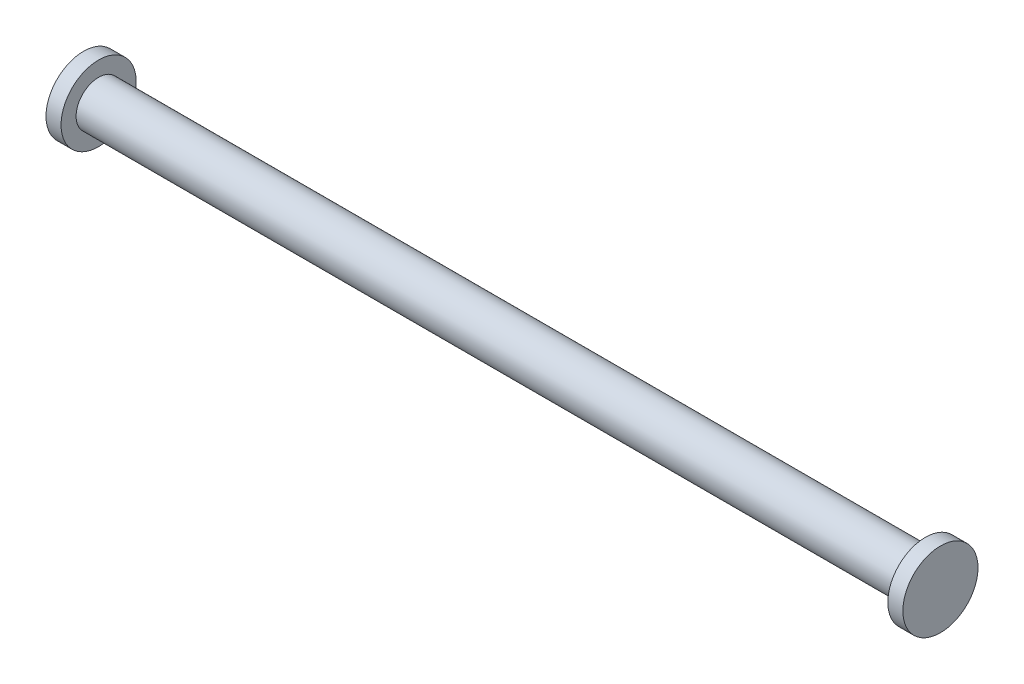
ISO-10303-21;
HEADER;
FILE_DESCRIPTION(('STEP AP214'),'2;1');
FILE_NAME('part.step','',(''),(''),'','','');
FILE_SCHEMA(('AUTOMOTIVE_DESIGN { 1 0 10303 214 1 1 1 1 }'));
ENDSEC;
DATA;
#1=APPLICATION_CONTEXT('core data for automotive mechanical design processes');
#2=APPLICATION_PROTOCOL_DEFINITION('international standard','automotive_design',2000,#1);
#3=PRODUCT_CONTEXT('',#1,'mechanical');
#4=PRODUCT('Part','Part','',(#3));
#5=PRODUCT_RELATED_PRODUCT_CATEGORY('part','',(#4));
#6=PRODUCT_DEFINITION_FORMATION('','',#4);
#7=PRODUCT_DEFINITION_CONTEXT('part definition',#1,'design');
#8=PRODUCT_DEFINITION('design','',#6,#7);
#9=PRODUCT_DEFINITION_SHAPE('','',#8);
#10=(LENGTH_UNIT() NAMED_UNIT(*) SI_UNIT(.MILLI.,.METRE.));
#11=(NAMED_UNIT(*) PLANE_ANGLE_UNIT() SI_UNIT($,.RADIAN.));
#12=(NAMED_UNIT(*) SI_UNIT($,.STERADIAN.) SOLID_ANGLE_UNIT());
#13=UNCERTAINTY_MEASURE_WITH_UNIT(LENGTH_MEASURE(1.E-05),#10,'distance_accuracy_value','');
#14=(GEOMETRIC_REPRESENTATION_CONTEXT(3) GLOBAL_UNCERTAINTY_ASSIGNED_CONTEXT((#13)) GLOBAL_UNIT_ASSIGNED_CONTEXT((#10,
#11,#12)) REPRESENTATION_CONTEXT('',''));
#15=CARTESIAN_POINT('',(0.,0.,0.));
#16=DIRECTION('',(0.,0.,1.));
#17=DIRECTION('',(1.,0.,0.));
#18=AXIS2_PLACEMENT_3D('',#15,#16,#17);
#19=CARTESIAN_POINT('',(139.7,0.,0.));
#20=DIRECTION('',(-1.,0.,0.));
#21=DIRECTION('',(0.,0.,1.));
#22=AXIS2_PLACEMENT_3D('',#19,#20,#21);
#23=CYLINDRICAL_SURFACE('',#22,3.81);
#24=CARTESIAN_POINT('',(139.7,0.,0.));
#25=DIRECTION('',(1.,0.,0.));
#26=DIRECTION('',(0.,0.,-1.));
#27=AXIS2_PLACEMENT_3D('',#24,#25,#26);
#28=CIRCLE('',#27,3.81);
#29=CARTESIAN_POINT('',(139.7,0.,-3.81));
#30=VERTEX_POINT('',#29);
#31=EDGE_CURVE('E10',#30,#30,#28,.T.);
#32=ORIENTED_EDGE('',*,*,#31,.F.);
#33=EDGE_LOOP('',(#32));
#34=FACE_BOUND('',#33,.T.);
#35=CARTESIAN_POINT('',(0.,0.,0.));
#36=DIRECTION('',(1.,0.,0.));
#37=DIRECTION('',(0.,0.,-1.));
#38=AXIS2_PLACEMENT_3D('',#35,#36,#37);
#39=CIRCLE('',#38,3.81);
#40=CARTESIAN_POINT('',(0.,0.,-3.81));
#41=VERTEX_POINT('',#40);
#42=EDGE_CURVE('E46',#41,#41,#39,.T.);
#43=ORIENTED_EDGE('',*,*,#42,.T.);
#44=EDGE_LOOP('',(#43));
#45=FACE_BOUND('',#44,.T.);
#46=ADVANCED_FACE('F43',(#34,#45),#23,.T.);
#47=CARTESIAN_POINT('',(142.24,0.,0.));
#48=DIRECTION('',(-1.,0.,0.));
#49=DIRECTION('',(0.,0.,1.));
#50=AXIS2_PLACEMENT_3D('',#47,#48,#49);
#51=CYLINDRICAL_SURFACE('',#50,6.35);
#52=CARTESIAN_POINT('',(142.24,0.,0.));
#53=DIRECTION('',(1.,0.,0.));
#54=DIRECTION('',(0.,0.,-1.));
#55=AXIS2_PLACEMENT_3D('',#52,#53,#54);
#56=CIRCLE('',#55,6.35);
#57=CARTESIAN_POINT('',(142.24,0.,-6.35));
#58=VERTEX_POINT('',#57);
#59=EDGE_CURVE('E51',#58,#58,#56,.T.);
#60=ORIENTED_EDGE('',*,*,#59,.F.);
#61=EDGE_LOOP('',(#60));
#62=FACE_BOUND('',#61,.T.);
#63=CARTESIAN_POINT('',(139.7,0.,0.));
#64=DIRECTION('',(1.,0.,0.));
#65=DIRECTION('',(0.,0.,-1.));
#66=AXIS2_PLACEMENT_3D('',#63,#64,#65);
#67=CIRCLE('',#66,6.35);
#68=CARTESIAN_POINT('',(139.7,0.,-6.35));
#69=VERTEX_POINT('',#68);
#70=EDGE_CURVE('E56',#69,#69,#67,.T.);
#71=ORIENTED_EDGE('',*,*,#70,.T.);
#72=EDGE_LOOP('',(#71));
#73=FACE_BOUND('',#72,.T.);
#74=ADVANCED_FACE('F97',(#62,#73),#51,.T.);
#75=CARTESIAN_POINT('',(142.24,0.,0.));
#76=DIRECTION('',(1.,0.,0.));
#77=DIRECTION('',(0.,0.,-1.));
#78=AXIS2_PLACEMENT_3D('',#75,#76,#77);
#79=PLANE('',#78);
#80=ORIENTED_EDGE('',*,*,#59,.T.);
#81=EDGE_LOOP('',(#80));
#82=FACE_BOUND('',#81,.T.);
#83=ADVANCED_FACE('F93',(#82),#79,.T.);
#84=CARTESIAN_POINT('',(139.7,0.,0.));
#85=DIRECTION('',(1.,0.,0.));
#86=DIRECTION('',(0.,0.,-1.));
#87=AXIS2_PLACEMENT_3D('',#84,#85,#86);
#88=PLANE('',#87);
#89=ORIENTED_EDGE('',*,*,#31,.T.);
#90=EDGE_LOOP('',(#89));
#91=FACE_BOUND('',#90,.T.);
#92=ORIENTED_EDGE('',*,*,#70,.F.);
#93=EDGE_LOOP('',(#92));
#94=FACE_BOUND('',#93,.T.);
#95=ADVANCED_FACE('F85',(#91,#94),#88,.F.);
#96=CARTESIAN_POINT('',(-2.54,0.,0.));
#97=DIRECTION('',(1.,0.,0.));
#98=DIRECTION('',(0.,0.,-1.));
#99=AXIS2_PLACEMENT_3D('',#96,#97,#98);
#100=CYLINDRICAL_SURFACE('',#99,6.35);
#101=CARTESIAN_POINT('',(-2.54,0.,0.));
#102=DIRECTION('',(-1.,0.,0.));
#103=DIRECTION('',(0.,0.,1.));
#104=AXIS2_PLACEMENT_3D('',#101,#102,#103);
#105=CIRCLE('',#104,6.35);
#106=CARTESIAN_POINT('',(-2.54,0.,6.35));
#107=VERTEX_POINT('',#106);
#108=EDGE_CURVE('E66',#107,#107,#105,.T.);
#109=ORIENTED_EDGE('',*,*,#108,.F.);
#110=EDGE_LOOP('',(#109));
#111=FACE_BOUND('',#110,.T.);
#112=CARTESIAN_POINT('',(0.,0.,0.));
#113=DIRECTION('',(-1.,0.,0.));
#114=DIRECTION('',(0.,0.,1.));
#115=AXIS2_PLACEMENT_3D('',#112,#113,#114);
#116=CIRCLE('',#115,6.35);
#117=CARTESIAN_POINT('',(0.,0.,6.35));
#118=VERTEX_POINT('',#117);
#119=EDGE_CURVE('E62',#118,#118,#116,.T.);
#120=ORIENTED_EDGE('',*,*,#119,.T.);
#121=EDGE_LOOP('',(#120));
#122=FACE_BOUND('',#121,.T.);
#123=ADVANCED_FACE('F83',(#111,#122),#100,.T.);
#124=CARTESIAN_POINT('',(-2.54,0.,0.));
#125=DIRECTION('',(-1.,0.,0.));
#126=DIRECTION('',(0.,0.,1.));
#127=AXIS2_PLACEMENT_3D('',#124,#125,#126);
#128=PLANE('',#127);
#129=ORIENTED_EDGE('',*,*,#108,.T.);
#130=EDGE_LOOP('',(#129));
#131=FACE_BOUND('',#130,.T.);
#132=ADVANCED_FACE('F79',(#131),#128,.T.);
#133=CARTESIAN_POINT('',(0.,0.,0.));
#134=DIRECTION('',(-1.,0.,0.));
#135=DIRECTION('',(0.,0.,1.));
#136=AXIS2_PLACEMENT_3D('',#133,#134,#135);
#137=PLANE('',#136);
#138=ORIENTED_EDGE('',*,*,#42,.F.);
#139=EDGE_LOOP('',(#138));
#140=FACE_BOUND('',#139,.T.);
#141=ORIENTED_EDGE('',*,*,#119,.F.);
#142=EDGE_LOOP('',(#141));
#143=FACE_BOUND('',#142,.T.);
#144=ADVANCED_FACE('F76',(#140,#143),#137,.F.);
#145=CLOSED_SHELL('',(#46,#74,#83,#95,#123,#132,#144));
#146=MANIFOLD_SOLID_BREP('B2',#145);
#147=ADVANCED_BREP_SHAPE_REPRESENTATION('',(#18,#146),#14);
#148=SHAPE_DEFINITION_REPRESENTATION(#9,#147);
ENDSEC;
END-ISO-10303-21;
